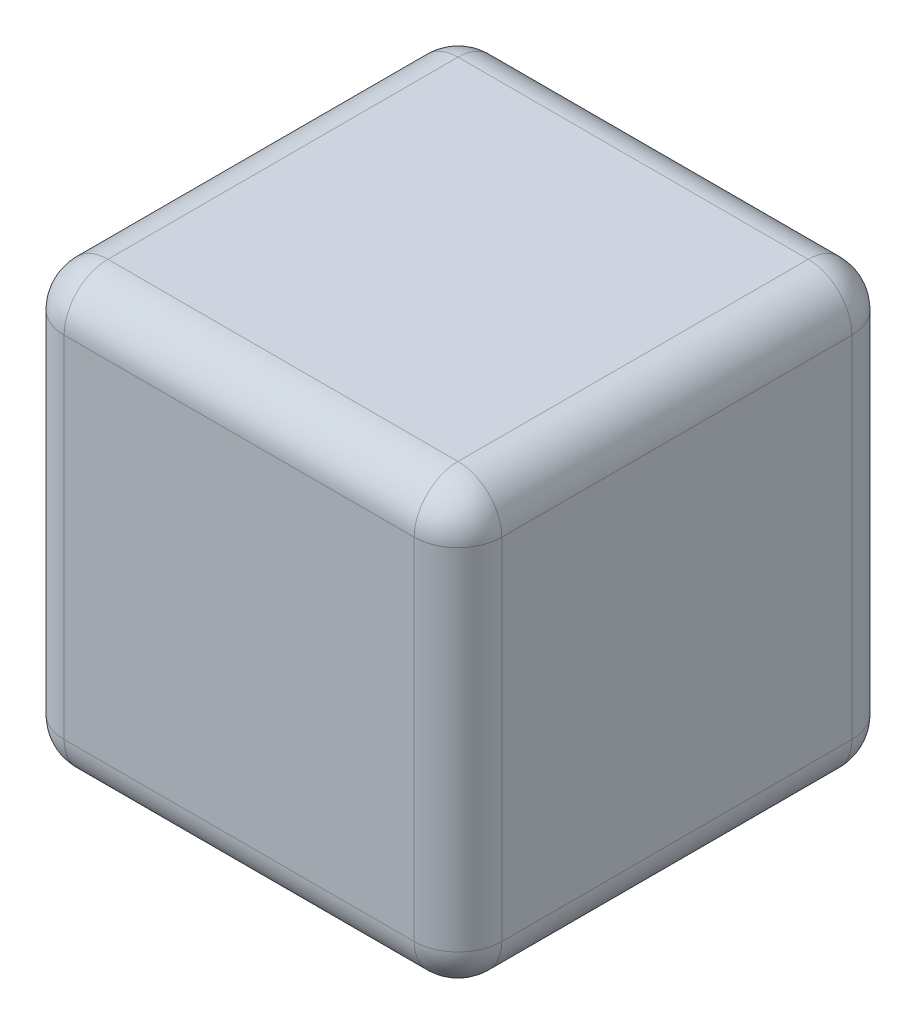
ISO-10303-21;
HEADER;
FILE_DESCRIPTION(('STEP AP214'),'2;1');
FILE_NAME('part.step','',(''),(''),'','','');
FILE_SCHEMA(('AUTOMOTIVE_DESIGN { 1 0 10303 214 1 1 1 1 }'));
ENDSEC;
DATA;
#1=APPLICATION_CONTEXT('core data for automotive mechanical design processes');
#2=APPLICATION_PROTOCOL_DEFINITION('international standard','automotive_design',2000,#1);
#3=PRODUCT_CONTEXT('',#1,'mechanical');
#4=PRODUCT('Part','Part','',(#3));
#5=PRODUCT_RELATED_PRODUCT_CATEGORY('part','',(#4));
#6=PRODUCT_DEFINITION_FORMATION('','',#4);
#7=PRODUCT_DEFINITION_CONTEXT('part definition',#1,'design');
#8=PRODUCT_DEFINITION('design','',#6,#7);
#9=PRODUCT_DEFINITION_SHAPE('','',#8);
#10=(LENGTH_UNIT() NAMED_UNIT(*) SI_UNIT(.MILLI.,.METRE.));
#11=(NAMED_UNIT(*) PLANE_ANGLE_UNIT() SI_UNIT($,.RADIAN.));
#12=(NAMED_UNIT(*) SI_UNIT($,.STERADIAN.) SOLID_ANGLE_UNIT());
#13=UNCERTAINTY_MEASURE_WITH_UNIT(LENGTH_MEASURE(1.E-05),#10,'distance_accuracy_value','');
#14=(GEOMETRIC_REPRESENTATION_CONTEXT(3) GLOBAL_UNCERTAINTY_ASSIGNED_CONTEXT((#13)) GLOBAL_UNIT_ASSIGNED_CONTEXT((#10,
#11,#12)) REPRESENTATION_CONTEXT('',''));
#15=CARTESIAN_POINT('',(0.,0.,0.));
#16=DIRECTION('',(0.,0.,1.));
#17=DIRECTION('',(1.,0.,0.));
#18=AXIS2_PLACEMENT_3D('',#15,#16,#17);
#19=CARTESIAN_POINT('',(2.5,5.,-2.5));
#20=DIRECTION('',(-1.,0.,0.));
#21=DIRECTION('',(0.,0.,1.));
#22=AXIS2_PLACEMENT_3D('',#19,#20,#21);
#23=PLANE('',#22);
#24=DIRECTION('',(0.,0.,-1.));
#25=VECTOR('',#24,1.);
#26=CARTESIAN_POINT('',(2.5,0.5,-2.5));
#27=LINE('',#26,#25);
#28=CARTESIAN_POINT('',(2.5,0.5,2.));
#29=VERTEX_POINT('',#28);
#30=CARTESIAN_POINT('',(2.5,0.5,-2.));
#31=VERTEX_POINT('',#30);
#32=EDGE_CURVE('E167',#29,#31,#27,.T.);
#33=ORIENTED_EDGE('',*,*,#32,.T.);
#34=DIRECTION('',(0.,-1.,0.));
#35=VECTOR('',#34,1.);
#36=CARTESIAN_POINT('',(2.5,5.,-2.));
#37=LINE('',#36,#35);
#38=CARTESIAN_POINT('',(2.5,4.5,-2.));
#39=VERTEX_POINT('',#38);
#40=EDGE_CURVE('E169',#31,#39,#37,.F.);
#41=ORIENTED_EDGE('',*,*,#40,.T.);
#42=DIRECTION('',(0.,0.,-1.));
#43=VECTOR('',#42,1.);
#44=CARTESIAN_POINT('',(2.5,4.5,2.5));
#45=LINE('',#44,#43);
#46=CARTESIAN_POINT('',(2.5,4.5,2.));
#47=VERTEX_POINT('',#46);
#48=EDGE_CURVE('E163',#39,#47,#45,.F.);
#49=ORIENTED_EDGE('',*,*,#48,.T.);
#50=DIRECTION('',(0.,-1.,0.));
#51=VECTOR('',#50,1.);
#52=CARTESIAN_POINT('',(2.5,5.,2.));
#53=LINE('',#52,#51);
#54=EDGE_CURVE('E165',#47,#29,#53,.T.);
#55=ORIENTED_EDGE('',*,*,#54,.T.);
#56=EDGE_LOOP('',(#33,#41,#49,#55));
#57=FACE_BOUND('',#56,.T.);
#58=ADVANCED_FACE('F32',(#57),#23,.F.);
#59=CARTESIAN_POINT('',(-2.5,5.,-2.5));
#60=DIRECTION('',(0.,0.,1.));
#61=DIRECTION('',(1.,0.,0.));
#62=AXIS2_PLACEMENT_3D('',#59,#60,#61);
#63=PLANE('',#62);
#64=DIRECTION('',(0.,-1.,0.));
#65=VECTOR('',#64,1.);
#66=CARTESIAN_POINT('',(2.,5.,-2.5));
#67=LINE('',#66,#65);
#68=CARTESIAN_POINT('',(2.,4.5,-2.5));
#69=VERTEX_POINT('',#68);
#70=CARTESIAN_POINT('',(2.,0.5,-2.5));
#71=VERTEX_POINT('',#70);
#72=EDGE_CURVE('E131',#69,#71,#67,.T.);
#73=ORIENTED_EDGE('',*,*,#72,.T.);
#74=DIRECTION('',(-1.,0.,0.));
#75=VECTOR('',#74,1.);
#76=CARTESIAN_POINT('',(-2.5,0.5,-2.5));
#77=LINE('',#76,#75);
#78=CARTESIAN_POINT('',(-2.,0.5,-2.5));
#79=VERTEX_POINT('',#78);
#80=EDGE_CURVE('E127',#71,#79,#77,.T.);
#81=ORIENTED_EDGE('',*,*,#80,.T.);
#82=DIRECTION('',(0.,-1.,0.));
#83=VECTOR('',#82,1.);
#84=CARTESIAN_POINT('',(-2.,5.,-2.5));
#85=LINE('',#84,#83);
#86=CARTESIAN_POINT('',(-2.,4.5,-2.5));
#87=VERTEX_POINT('',#86);
#88=EDGE_CURVE('E119',#79,#87,#85,.F.);
#89=ORIENTED_EDGE('',*,*,#88,.T.);
#90=DIRECTION('',(-1.,0.,0.));
#91=VECTOR('',#90,1.);
#92=CARTESIAN_POINT('',(2.5,4.5,-2.5));
#93=LINE('',#92,#91);
#94=EDGE_CURVE('E124',#87,#69,#93,.F.);
#95=ORIENTED_EDGE('',*,*,#94,.T.);
#96=EDGE_LOOP('',(#73,#81,#89,#95));
#97=FACE_BOUND('',#96,.T.);
#98=ADVANCED_FACE('F122',(#97),#63,.F.);
#99=CARTESIAN_POINT('',(-2.5,5.,-2.5));
#100=DIRECTION('',(1.,0.,0.));
#101=DIRECTION('',(0.,0.,-1.));
#102=AXIS2_PLACEMENT_3D('',#99,#100,#101);
#103=PLANE('',#102);
#104=DIRECTION('',(0.,0.,1.));
#105=VECTOR('',#104,1.);
#106=CARTESIAN_POINT('',(-2.5,4.5,-2.5));
#107=LINE('',#106,#105);
#108=CARTESIAN_POINT('',(-2.5,4.5,2.));
#109=VERTEX_POINT('',#108);
#110=CARTESIAN_POINT('',(-2.5,4.5,-2.));
#111=VERTEX_POINT('',#110);
#112=EDGE_CURVE('E172',#109,#111,#107,.F.);
#113=ORIENTED_EDGE('',*,*,#112,.T.);
#114=DIRECTION('',(0.,-1.,0.));
#115=VECTOR('',#114,1.);
#116=CARTESIAN_POINT('',(-2.5,5.,-2.));
#117=LINE('',#116,#115);
#118=CARTESIAN_POINT('',(-2.5,0.5,-2.));
#119=VERTEX_POINT('',#118);
#120=EDGE_CURVE('E139',#111,#119,#117,.T.);
#121=ORIENTED_EDGE('',*,*,#120,.T.);
#122=DIRECTION('',(0.,0.,1.));
#123=VECTOR('',#122,1.);
#124=CARTESIAN_POINT('',(-2.5,0.5,-2.5));
#125=LINE('',#124,#123);
#126=CARTESIAN_POINT('',(-2.5,0.5,2.));
#127=VERTEX_POINT('',#126);
#128=EDGE_CURVE('E176',#119,#127,#125,.T.);
#129=ORIENTED_EDGE('',*,*,#128,.T.);
#130=DIRECTION('',(0.,-1.,0.));
#131=VECTOR('',#130,1.);
#132=CARTESIAN_POINT('',(-2.5,5.,2.));
#133=LINE('',#132,#131);
#134=EDGE_CURVE('E174',#127,#109,#133,.F.);
#135=ORIENTED_EDGE('',*,*,#134,.T.);
#136=EDGE_LOOP('',(#113,#121,#129,#135));
#137=FACE_BOUND('',#136,.T.);
#138=ADVANCED_FACE('F296',(#137),#103,.F.);
#139=CARTESIAN_POINT('',(-2.5,5.,2.5));
#140=DIRECTION('',(0.,0.,-1.));
#141=DIRECTION('',(-1.,0.,0.));
#142=AXIS2_PLACEMENT_3D('',#139,#140,#141);
#143=PLANE('',#142);
#144=DIRECTION('',(1.,0.,0.));
#145=VECTOR('',#144,1.);
#146=CARTESIAN_POINT('',(-2.5,4.5,2.5));
#147=LINE('',#146,#145);
#148=CARTESIAN_POINT('',(2.,4.5,2.5));
#149=VERTEX_POINT('',#148);
#150=CARTESIAN_POINT('',(-2.,4.5,2.5));
#151=VERTEX_POINT('',#150);
#152=EDGE_CURVE('E188',#149,#151,#147,.F.);
#153=ORIENTED_EDGE('',*,*,#152,.T.);
#154=DIRECTION('',(0.,-1.,0.));
#155=VECTOR('',#154,1.);
#156=CARTESIAN_POINT('',(-2.,5.,2.5));
#157=LINE('',#156,#155);
#158=CARTESIAN_POINT('',(-2.,0.5,2.5));
#159=VERTEX_POINT('',#158);
#160=EDGE_CURVE('E194',#151,#159,#157,.T.);
#161=ORIENTED_EDGE('',*,*,#160,.T.);
#162=DIRECTION('',(1.,0.,0.));
#163=VECTOR('',#162,1.);
#164=CARTESIAN_POINT('',(-2.5,0.5,2.5));
#165=LINE('',#164,#163);
#166=CARTESIAN_POINT('',(2.,0.5,2.5));
#167=VERTEX_POINT('',#166);
#168=EDGE_CURVE('E192',#159,#167,#165,.T.);
#169=ORIENTED_EDGE('',*,*,#168,.T.);
#170=DIRECTION('',(0.,-1.,0.));
#171=VECTOR('',#170,1.);
#172=CARTESIAN_POINT('',(2.,5.,2.5));
#173=LINE('',#172,#171);
#174=EDGE_CURVE('E190',#167,#149,#173,.F.);
#175=ORIENTED_EDGE('',*,*,#174,.T.);
#176=EDGE_LOOP('',(#153,#161,#169,#175));
#177=FACE_BOUND('',#176,.T.);
#178=ADVANCED_FACE('F273',(#177),#143,.F.);
#179=CARTESIAN_POINT('',(0.,5.,0.));
#180=DIRECTION('',(0.,1.,0.));
#181=DIRECTION('',(0.,0.,1.));
#182=AXIS2_PLACEMENT_3D('',#179,#180,#181);
#183=PLANE('',#182);
#184=DIRECTION('',(-1.,0.,0.));
#185=VECTOR('',#184,1.);
#186=CARTESIAN_POINT('',(-2.5,5.,-2.));
#187=LINE('',#186,#185);
#188=CARTESIAN_POINT('',(2.,5.,-2.));
#189=VERTEX_POINT('',#188);
#190=CARTESIAN_POINT('',(-2.,5.,-2.));
#191=VERTEX_POINT('',#190);
#192=EDGE_CURVE('E41',#189,#191,#187,.T.);
#193=ORIENTED_EDGE('',*,*,#192,.T.);
#194=DIRECTION('',(0.,0.,1.));
#195=VECTOR('',#194,1.);
#196=CARTESIAN_POINT('',(-2.,5.,2.5));
#197=LINE('',#196,#195);
#198=CARTESIAN_POINT('',(-2.,5.,2.));
#199=VERTEX_POINT('',#198);
#200=EDGE_CURVE('E11',#191,#199,#197,.T.);
#201=ORIENTED_EDGE('',*,*,#200,.T.);
#202=DIRECTION('',(1.,0.,0.));
#203=VECTOR('',#202,1.);
#204=CARTESIAN_POINT('',(2.5,5.,2.));
#205=LINE('',#204,#203);
#206=CARTESIAN_POINT('',(2.,5.,2.));
#207=VERTEX_POINT('',#206);
#208=EDGE_CURVE('E197',#199,#207,#205,.T.);
#209=ORIENTED_EDGE('',*,*,#208,.T.);
#210=DIRECTION('',(0.,0.,-1.));
#211=VECTOR('',#210,1.);
#212=CARTESIAN_POINT('',(2.,5.,-2.5));
#213=LINE('',#212,#211);
#214=EDGE_CURVE('E52',#207,#189,#213,.T.);
#215=ORIENTED_EDGE('',*,*,#214,.T.);
#216=EDGE_LOOP('',(#193,#201,#209,#215));
#217=FACE_BOUND('',#216,.T.);
#218=ADVANCED_FACE('F303',(#217),#183,.T.);
#219=CARTESIAN_POINT('',(0.,0.,0.));
#220=DIRECTION('',(0.,1.,0.));
#221=DIRECTION('',(0.,0.,1.));
#222=AXIS2_PLACEMENT_3D('',#219,#220,#221);
#223=PLANE('',#222);
#224=DIRECTION('',(0.,0.,1.));
#225=VECTOR('',#224,1.);
#226=CARTESIAN_POINT('',(-2.,0.,0.));
#227=LINE('',#226,#225);
#228=CARTESIAN_POINT('',(-2.,0.,2.));
#229=VERTEX_POINT('',#228);
#230=CARTESIAN_POINT('',(-2.,0.,-2.));
#231=VERTEX_POINT('',#230);
#232=EDGE_CURVE('E183',#229,#231,#227,.F.);
#233=ORIENTED_EDGE('',*,*,#232,.T.);
#234=DIRECTION('',(-1.,0.,0.));
#235=VECTOR('',#234,1.);
#236=CARTESIAN_POINT('',(0.,0.,-2.));
#237=LINE('',#236,#235);
#238=CARTESIAN_POINT('',(2.,0.,-2.));
#239=VERTEX_POINT('',#238);
#240=EDGE_CURVE('E185',#231,#239,#237,.F.);
#241=ORIENTED_EDGE('',*,*,#240,.T.);
#242=DIRECTION('',(0.,0.,-1.));
#243=VECTOR('',#242,1.);
#244=CARTESIAN_POINT('',(2.,0.,0.));
#245=LINE('',#244,#243);
#246=CARTESIAN_POINT('',(2.,0.,2.));
#247=VERTEX_POINT('',#246);
#248=EDGE_CURVE('E181',#239,#247,#245,.F.);
#249=ORIENTED_EDGE('',*,*,#248,.T.);
#250=DIRECTION('',(1.,0.,0.));
#251=VECTOR('',#250,1.);
#252=CARTESIAN_POINT('',(0.,0.,2.));
#253=LINE('',#252,#251);
#254=EDGE_CURVE('E179',#247,#229,#253,.F.);
#255=ORIENTED_EDGE('',*,*,#254,.T.);
#256=EDGE_LOOP('',(#233,#241,#249,#255));
#257=FACE_BOUND('',#256,.T.);
#258=ADVANCED_FACE('F264',(#257),#223,.F.);
#259=CARTESIAN_POINT('',(-2.,5.,2.));
#260=DIRECTION('',(0.,-1.,0.));
#261=DIRECTION('',(0.,0.,-1.));
#262=AXIS2_PLACEMENT_3D('',#259,#260,#261);
#263=CYLINDRICAL_SURFACE('',#262,0.5);
#264=CARTESIAN_POINT('',(-2.,4.5,2.));
#265=DIRECTION('',(0.,1.,0.));
#266=DIRECTION('',(0.,0.,1.));
#267=AXIS2_PLACEMENT_3D('',#264,#265,#266);
#268=CIRCLE('',#267,0.5);
#269=EDGE_CURVE('E36',#109,#151,#268,.T.);
#270=ORIENTED_EDGE('',*,*,#269,.F.);
#271=ORIENTED_EDGE('',*,*,#134,.F.);
#272=CARTESIAN_POINT('',(-2.,0.5,2.));
#273=DIRECTION('',(0.,-1.,0.));
#274=DIRECTION('',(0.,0.,-1.));
#275=AXIS2_PLACEMENT_3D('',#272,#273,#274);
#276=CIRCLE('',#275,0.5);
#277=EDGE_CURVE('E159',#159,#127,#276,.T.);
#278=ORIENTED_EDGE('',*,*,#277,.F.);
#279=ORIENTED_EDGE('',*,*,#160,.F.);
#280=EDGE_LOOP('',(#270,#271,#278,#279));
#281=FACE_BOUND('',#280,.T.);
#282=ADVANCED_FACE('F34',(#281),#263,.T.);
#283=CARTESIAN_POINT('',(-2.,4.5,2.));
#284=DIRECTION('',(0.,0.,1.));
#285=DIRECTION('',(1.,0.,0.));
#286=AXIS2_PLACEMENT_3D('',#283,#284,#285);
#287=SPHERICAL_SURFACE('',#286,0.5);
#288=CARTESIAN_POINT('',(-2.,4.5,2.));
#289=DIRECTION('',(0.,0.,1.));
#290=DIRECTION('',(1.,0.,0.));
#291=AXIS2_PLACEMENT_3D('',#288,#289,#290);
#292=CIRCLE('',#291,0.5);
#293=EDGE_CURVE('E243',#109,#199,#292,.F.);
#294=ORIENTED_EDGE('',*,*,#293,.F.);
#295=ORIENTED_EDGE('',*,*,#269,.T.);
#296=CARTESIAN_POINT('',(-2.,4.5,2.));
#297=DIRECTION('',(-1.,0.,0.));
#298=DIRECTION('',(0.,0.,1.));
#299=AXIS2_PLACEMENT_3D('',#296,#297,#298);
#300=CIRCLE('',#299,0.5);
#301=EDGE_CURVE('E246',#199,#151,#300,.F.);
#302=ORIENTED_EDGE('',*,*,#301,.F.);
#303=EDGE_LOOP('',(#294,#295,#302));
#304=FACE_BOUND('',#303,.T.);
#305=ADVANCED_FACE('F291',(#304),#287,.T.);
#306=CARTESIAN_POINT('',(-2.,0.5,2.));
#307=DIRECTION('',(0.,0.,1.));
#308=DIRECTION('',(1.,0.,0.));
#309=AXIS2_PLACEMENT_3D('',#306,#307,#308);
#310=SPHERICAL_SURFACE('',#309,0.5);
#311=CARTESIAN_POINT('',(-2.,0.5,2.));
#312=DIRECTION('',(-1.,0.,0.));
#313=DIRECTION('',(0.,0.,1.));
#314=AXIS2_PLACEMENT_3D('',#311,#312,#313);
#315=CIRCLE('',#314,0.5);
#316=EDGE_CURVE('E237',#159,#229,#315,.F.);
#317=ORIENTED_EDGE('',*,*,#316,.F.);
#318=ORIENTED_EDGE('',*,*,#277,.T.);
#319=CARTESIAN_POINT('',(-2.,0.5,2.));
#320=DIRECTION('',(0.,0.,1.));
#321=DIRECTION('',(1.,0.,0.));
#322=AXIS2_PLACEMENT_3D('',#319,#320,#321);
#323=CIRCLE('',#322,0.5);
#324=EDGE_CURVE('E240',#229,#127,#323,.F.);
#325=ORIENTED_EDGE('',*,*,#324,.F.);
#326=EDGE_LOOP('',(#317,#318,#325));
#327=FACE_BOUND('',#326,.T.);
#328=ADVANCED_FACE('F253',(#327),#310,.T.);
#329=CARTESIAN_POINT('',(0.,4.5,2.));
#330=DIRECTION('',(-1.,0.,0.));
#331=DIRECTION('',(0.,0.,1.));
#332=AXIS2_PLACEMENT_3D('',#329,#330,#331);
#333=CYLINDRICAL_SURFACE('',#332,0.5);
#334=ORIENTED_EDGE('',*,*,#301,.T.);
#335=ORIENTED_EDGE('',*,*,#152,.F.);
#336=CARTESIAN_POINT('',(2.,4.5,2.));
#337=DIRECTION('',(1.,0.,0.));
#338=DIRECTION('',(0.,0.,-1.));
#339=AXIS2_PLACEMENT_3D('',#336,#337,#338);
#340=CIRCLE('',#339,0.5);
#341=EDGE_CURVE('E231',#207,#149,#340,.T.);
#342=ORIENTED_EDGE('',*,*,#341,.F.);
#343=ORIENTED_EDGE('',*,*,#208,.F.);
#344=EDGE_LOOP('',(#334,#335,#342,#343));
#345=FACE_BOUND('',#344,.T.);
#346=ADVANCED_FACE('F286',(#345),#333,.T.);
#347=CARTESIAN_POINT('',(-2.,4.5,0.));
#348=DIRECTION('',(0.,0.,-1.));
#349=DIRECTION('',(-1.,0.,0.));
#350=AXIS2_PLACEMENT_3D('',#347,#348,#349);
#351=CYLINDRICAL_SURFACE('',#350,0.5);
#352=ORIENTED_EDGE('',*,*,#293,.T.);
#353=ORIENTED_EDGE('',*,*,#200,.F.);
#354=CARTESIAN_POINT('',(-2.,4.5,-2.));
#355=DIRECTION('',(0.,0.,-1.));
#356=DIRECTION('',(-1.,0.,0.));
#357=AXIS2_PLACEMENT_3D('',#354,#355,#356);
#358=CIRCLE('',#357,0.5);
#359=EDGE_CURVE('E143',#111,#191,#358,.T.);
#360=ORIENTED_EDGE('',*,*,#359,.F.);
#361=ORIENTED_EDGE('',*,*,#112,.F.);
#362=EDGE_LOOP('',(#352,#353,#360,#361));
#363=FACE_BOUND('',#362,.T.);
#364=ADVANCED_FACE('F294',(#363),#351,.T.);
#365=CARTESIAN_POINT('',(-2.,5.,-2.));
#366=DIRECTION('',(0.,-1.,0.));
#367=DIRECTION('',(0.,0.,-1.));
#368=AXIS2_PLACEMENT_3D('',#365,#366,#367);
#369=CYLINDRICAL_SURFACE('',#368,0.5);
#370=CARTESIAN_POINT('',(-2.,0.5,-2.));
#371=DIRECTION('',(0.,-1.,0.));
#372=DIRECTION('',(0.,0.,-1.));
#373=AXIS2_PLACEMENT_3D('',#370,#371,#372);
#374=CIRCLE('',#373,0.5);
#375=EDGE_CURVE('E144',#119,#79,#374,.T.);
#376=ORIENTED_EDGE('',*,*,#375,.F.);
#377=ORIENTED_EDGE('',*,*,#120,.F.);
#378=CARTESIAN_POINT('',(-2.,4.5,-2.));
#379=DIRECTION('',(0.,1.,0.));
#380=DIRECTION('',(0.,0.,1.));
#381=AXIS2_PLACEMENT_3D('',#378,#379,#380);
#382=CIRCLE('',#381,0.5);
#383=EDGE_CURVE('E135',#87,#111,#382,.T.);
#384=ORIENTED_EDGE('',*,*,#383,.F.);
#385=ORIENTED_EDGE('',*,*,#88,.F.);
#386=EDGE_LOOP('',(#376,#377,#384,#385));
#387=FACE_BOUND('',#386,.T.);
#388=ADVANCED_FACE('F137',(#387),#369,.T.);
#389=CARTESIAN_POINT('',(-2.,0.5,-2.5));
#390=DIRECTION('',(0.,0.,1.));
#391=DIRECTION('',(1.,0.,0.));
#392=AXIS2_PLACEMENT_3D('',#389,#390,#391);
#393=CYLINDRICAL_SURFACE('',#392,0.5);
#394=ORIENTED_EDGE('',*,*,#324,.T.);
#395=ORIENTED_EDGE('',*,*,#128,.F.);
#396=CARTESIAN_POINT('',(-2.,0.5,-2.));
#397=DIRECTION('',(0.,0.,-1.));
#398=DIRECTION('',(-1.,0.,0.));
#399=AXIS2_PLACEMENT_3D('',#396,#397,#398);
#400=CIRCLE('',#399,0.5);
#401=EDGE_CURVE('E227',#231,#119,#400,.T.);
#402=ORIENTED_EDGE('',*,*,#401,.F.);
#403=ORIENTED_EDGE('',*,*,#232,.F.);
#404=EDGE_LOOP('',(#394,#395,#402,#403));
#405=FACE_BOUND('',#404,.T.);
#406=ADVANCED_FACE('F260',(#405),#393,.T.);
#407=CARTESIAN_POINT('',(-2.5,0.5,2.));
#408=DIRECTION('',(1.,0.,0.));
#409=DIRECTION('',(0.,0.,-1.));
#410=AXIS2_PLACEMENT_3D('',#407,#408,#409);
#411=CYLINDRICAL_SURFACE('',#410,0.5);
#412=ORIENTED_EDGE('',*,*,#316,.T.);
#413=ORIENTED_EDGE('',*,*,#254,.F.);
#414=CARTESIAN_POINT('',(2.,0.5,2.));
#415=DIRECTION('',(1.,0.,0.));
#416=DIRECTION('',(0.,0.,-1.));
#417=AXIS2_PLACEMENT_3D('',#414,#415,#416);
#418=CIRCLE('',#417,0.5);
#419=EDGE_CURVE('E224',#167,#247,#418,.T.);
#420=ORIENTED_EDGE('',*,*,#419,.F.);
#421=ORIENTED_EDGE('',*,*,#168,.F.);
#422=EDGE_LOOP('',(#412,#413,#420,#421));
#423=FACE_BOUND('',#422,.T.);
#424=ADVANCED_FACE('F270',(#423),#411,.T.);
#425=CARTESIAN_POINT('',(2.,5.,2.));
#426=DIRECTION('',(0.,-1.,0.));
#427=DIRECTION('',(0.,0.,-1.));
#428=AXIS2_PLACEMENT_3D('',#425,#426,#427);
#429=CYLINDRICAL_SURFACE('',#428,0.5);
#430=CARTESIAN_POINT('',(2.,4.5,2.));
#431=DIRECTION('',(0.,1.,0.));
#432=DIRECTION('',(0.,0.,1.));
#433=AXIS2_PLACEMENT_3D('',#430,#431,#432);
#434=CIRCLE('',#433,0.5);
#435=EDGE_CURVE('E234',#149,#47,#434,.T.);
#436=ORIENTED_EDGE('',*,*,#435,.F.);
#437=ORIENTED_EDGE('',*,*,#174,.F.);
#438=CARTESIAN_POINT('',(2.,0.5,2.));
#439=DIRECTION('',(0.,-1.,0.));
#440=DIRECTION('',(0.,0.,-1.));
#441=AXIS2_PLACEMENT_3D('',#438,#439,#440);
#442=CIRCLE('',#441,0.5);
#443=EDGE_CURVE('E221',#29,#167,#442,.T.);
#444=ORIENTED_EDGE('',*,*,#443,.F.);
#445=ORIENTED_EDGE('',*,*,#54,.F.);
#446=EDGE_LOOP('',(#436,#437,#444,#445));
#447=FACE_BOUND('',#446,.T.);
#448=ADVANCED_FACE('F278',(#447),#429,.T.);
#449=CARTESIAN_POINT('',(2.,4.5,2.));
#450=DIRECTION('',(0.,0.,1.));
#451=DIRECTION('',(1.,0.,0.));
#452=AXIS2_PLACEMENT_3D('',#449,#450,#451);
#453=SPHERICAL_SURFACE('',#452,0.5);
#454=ORIENTED_EDGE('',*,*,#341,.T.);
#455=ORIENTED_EDGE('',*,*,#435,.T.);
#456=CARTESIAN_POINT('',(2.,4.5,2.));
#457=DIRECTION('',(0.,0.,1.));
#458=DIRECTION('',(0.,-1.,0.));
#459=AXIS2_PLACEMENT_3D('',#456,#457,#458);
#460=CIRCLE('',#459,0.5);
#461=EDGE_CURVE('E150',#207,#47,#460,.F.);
#462=ORIENTED_EDGE('',*,*,#461,.F.);
#463=EDGE_LOOP('',(#454,#455,#462));
#464=FACE_BOUND('',#463,.T.);
#465=ADVANCED_FACE('F284',(#464),#453,.T.);
#466=CARTESIAN_POINT('',(-2.,4.5,-2.));
#467=DIRECTION('',(0.,0.,1.));
#468=DIRECTION('',(1.,0.,0.));
#469=AXIS2_PLACEMENT_3D('',#466,#467,#468);
#470=SPHERICAL_SURFACE('',#469,0.5);
#471=ORIENTED_EDGE('',*,*,#383,.T.);
#472=ORIENTED_EDGE('',*,*,#359,.T.);
#473=CARTESIAN_POINT('',(-2.,4.5,-2.));
#474=DIRECTION('',(-1.,0.,0.));
#475=DIRECTION('',(0.,0.,1.));
#476=AXIS2_PLACEMENT_3D('',#473,#474,#475);
#477=CIRCLE('',#476,0.5);
#478=EDGE_CURVE('E147',#87,#191,#477,.F.);
#479=ORIENTED_EDGE('',*,*,#478,.F.);
#480=EDGE_LOOP('',(#471,#472,#479));
#481=FACE_BOUND('',#480,.T.);
#482=ADVANCED_FACE('F148',(#481),#470,.T.);
#483=CARTESIAN_POINT('',(-2.,0.5,-2.));
#484=DIRECTION('',(0.,0.,1.));
#485=DIRECTION('',(1.,0.,0.));
#486=AXIS2_PLACEMENT_3D('',#483,#484,#485);
#487=SPHERICAL_SURFACE('',#486,0.5);
#488=ORIENTED_EDGE('',*,*,#401,.T.);
#489=ORIENTED_EDGE('',*,*,#375,.T.);
#490=CARTESIAN_POINT('',(-2.,0.5,-2.));
#491=DIRECTION('',(-1.,0.,0.));
#492=DIRECTION('',(0.,0.,1.));
#493=AXIS2_PLACEMENT_3D('',#490,#491,#492);
#494=CIRCLE('',#493,0.5);
#495=EDGE_CURVE('E151',#231,#79,#494,.F.);
#496=ORIENTED_EDGE('',*,*,#495,.F.);
#497=EDGE_LOOP('',(#488,#489,#496));
#498=FACE_BOUND('',#497,.T.);
#499=ADVANCED_FACE('F341',(#498),#487,.T.);
#500=CARTESIAN_POINT('',(2.,0.5,2.));
#501=DIRECTION('',(0.,0.,1.));
#502=DIRECTION('',(1.,0.,0.));
#503=AXIS2_PLACEMENT_3D('',#500,#501,#502);
#504=SPHERICAL_SURFACE('',#503,0.5);
#505=ORIENTED_EDGE('',*,*,#443,.T.);
#506=ORIENTED_EDGE('',*,*,#419,.T.);
#507=CARTESIAN_POINT('',(2.,0.5,2.));
#508=DIRECTION('',(0.,0.,1.));
#509=DIRECTION('',(1.,0.,0.));
#510=AXIS2_PLACEMENT_3D('',#507,#508,#509);
#511=CIRCLE('',#510,0.5);
#512=EDGE_CURVE('E214',#29,#247,#511,.F.);
#513=ORIENTED_EDGE('',*,*,#512,.F.);
#514=EDGE_LOOP('',(#505,#506,#513));
#515=FACE_BOUND('',#514,.T.);
#516=ADVANCED_FACE('F337',(#515),#504,.T.);
#517=CARTESIAN_POINT('',(2.,4.5,0.));
#518=DIRECTION('',(0.,0.,1.));
#519=DIRECTION('',(1.,0.,0.));
#520=AXIS2_PLACEMENT_3D('',#517,#518,#519);
#521=CYLINDRICAL_SURFACE('',#520,0.5);
#522=ORIENTED_EDGE('',*,*,#461,.T.);
#523=ORIENTED_EDGE('',*,*,#48,.F.);
#524=CARTESIAN_POINT('',(2.,4.5,-2.));
#525=DIRECTION('',(0.,0.,-1.));
#526=DIRECTION('',(-1.,0.,0.));
#527=AXIS2_PLACEMENT_3D('',#524,#525,#526);
#528=CIRCLE('',#527,0.5);
#529=EDGE_CURVE('E211',#189,#39,#528,.T.);
#530=ORIENTED_EDGE('',*,*,#529,.F.);
#531=ORIENTED_EDGE('',*,*,#214,.F.);
#532=EDGE_LOOP('',(#522,#523,#530,#531));
#533=FACE_BOUND('',#532,.T.);
#534=ADVANCED_FACE('F334',(#533),#521,.T.);
#535=CARTESIAN_POINT('',(0.,4.5,-2.));
#536=DIRECTION('',(1.,0.,0.));
#537=DIRECTION('',(0.,0.,-1.));
#538=AXIS2_PLACEMENT_3D('',#535,#536,#537);
#539=CYLINDRICAL_SURFACE('',#538,0.5);
#540=ORIENTED_EDGE('',*,*,#478,.T.);
#541=ORIENTED_EDGE('',*,*,#192,.F.);
#542=CARTESIAN_POINT('',(2.,4.5,-2.));
#543=DIRECTION('',(1.,0.,0.));
#544=DIRECTION('',(0.,1.,0.));
#545=AXIS2_PLACEMENT_3D('',#542,#543,#544);
#546=CIRCLE('',#545,0.5);
#547=EDGE_CURVE('E155',#69,#189,#546,.T.);
#548=ORIENTED_EDGE('',*,*,#547,.F.);
#549=ORIENTED_EDGE('',*,*,#94,.F.);
#550=EDGE_LOOP('',(#540,#541,#548,#549));
#551=FACE_BOUND('',#550,.T.);
#552=ADVANCED_FACE('F153',(#551),#539,.T.);
#553=CARTESIAN_POINT('',(-2.5,0.5,-2.));
#554=DIRECTION('',(-1.,0.,0.));
#555=DIRECTION('',(0.,0.,1.));
#556=AXIS2_PLACEMENT_3D('',#553,#554,#555);
#557=CYLINDRICAL_SURFACE('',#556,0.5);
#558=ORIENTED_EDGE('',*,*,#495,.T.);
#559=ORIENTED_EDGE('',*,*,#80,.F.);
#560=CARTESIAN_POINT('',(2.,0.5,-2.));
#561=DIRECTION('',(1.,0.,0.));
#562=DIRECTION('',(0.,0.,-1.));
#563=AXIS2_PLACEMENT_3D('',#560,#561,#562);
#564=CIRCLE('',#563,0.5);
#565=EDGE_CURVE('E207',#239,#71,#564,.T.);
#566=ORIENTED_EDGE('',*,*,#565,.F.);
#567=ORIENTED_EDGE('',*,*,#240,.F.);
#568=EDGE_LOOP('',(#558,#559,#566,#567));
#569=FACE_BOUND('',#568,.T.);
#570=ADVANCED_FACE('F327',(#569),#557,.T.);
#571=CARTESIAN_POINT('',(2.,0.5,-2.5));
#572=DIRECTION('',(0.,0.,-1.));
#573=DIRECTION('',(-1.,0.,0.));
#574=AXIS2_PLACEMENT_3D('',#571,#572,#573);
#575=CYLINDRICAL_SURFACE('',#574,0.5);
#576=ORIENTED_EDGE('',*,*,#512,.T.);
#577=ORIENTED_EDGE('',*,*,#248,.F.);
#578=CARTESIAN_POINT('',(2.,0.5,-2.));
#579=DIRECTION('',(0.,0.,-1.));
#580=DIRECTION('',(-1.,0.,0.));
#581=AXIS2_PLACEMENT_3D('',#578,#579,#580);
#582=CIRCLE('',#581,0.5);
#583=EDGE_CURVE('E205',#31,#239,#582,.T.);
#584=ORIENTED_EDGE('',*,*,#583,.F.);
#585=ORIENTED_EDGE('',*,*,#32,.F.);
#586=EDGE_LOOP('',(#576,#577,#584,#585));
#587=FACE_BOUND('',#586,.T.);
#588=ADVANCED_FACE('F323',(#587),#575,.T.);
#589=CARTESIAN_POINT('',(2.,4.5,-2.));
#590=DIRECTION('',(0.,0.,1.));
#591=DIRECTION('',(1.,0.,0.));
#592=AXIS2_PLACEMENT_3D('',#589,#590,#591);
#593=SPHERICAL_SURFACE('',#592,0.5);
#594=ORIENTED_EDGE('',*,*,#547,.T.);
#595=ORIENTED_EDGE('',*,*,#529,.T.);
#596=CARTESIAN_POINT('',(2.,4.5,-2.));
#597=DIRECTION('',(0.,1.,0.));
#598=DIRECTION('',(0.,0.,1.));
#599=AXIS2_PLACEMENT_3D('',#596,#597,#598);
#600=CIRCLE('',#599,0.5);
#601=EDGE_CURVE('E203',#69,#39,#600,.F.);
#602=ORIENTED_EDGE('',*,*,#601,.F.);
#603=EDGE_LOOP('',(#594,#595,#602));
#604=FACE_BOUND('',#603,.T.);
#605=ADVANCED_FACE('F319',(#604),#593,.T.);
#606=CARTESIAN_POINT('',(2.,0.5,-2.));
#607=DIRECTION('',(0.,0.,1.));
#608=DIRECTION('',(1.,0.,0.));
#609=AXIS2_PLACEMENT_3D('',#606,#607,#608);
#610=SPHERICAL_SURFACE('',#609,0.5);
#611=ORIENTED_EDGE('',*,*,#583,.T.);
#612=ORIENTED_EDGE('',*,*,#565,.T.);
#613=CARTESIAN_POINT('',(2.,0.5,-2.));
#614=DIRECTION('',(0.,-1.,0.));
#615=DIRECTION('',(0.,0.,-1.));
#616=AXIS2_PLACEMENT_3D('',#613,#614,#615);
#617=CIRCLE('',#616,0.5);
#618=EDGE_CURVE('E201',#31,#71,#617,.F.);
#619=ORIENTED_EDGE('',*,*,#618,.F.);
#620=EDGE_LOOP('',(#611,#612,#619));
#621=FACE_BOUND('',#620,.T.);
#622=ADVANCED_FACE('F315',(#621),#610,.T.);
#623=CARTESIAN_POINT('',(2.,5.,-2.));
#624=DIRECTION('',(0.,-1.,0.));
#625=DIRECTION('',(0.,0.,-1.));
#626=AXIS2_PLACEMENT_3D('',#623,#624,#625);
#627=CYLINDRICAL_SURFACE('',#626,0.5);
#628=ORIENTED_EDGE('',*,*,#601,.T.);
#629=ORIENTED_EDGE('',*,*,#40,.F.);
#630=ORIENTED_EDGE('',*,*,#618,.T.);
#631=ORIENTED_EDGE('',*,*,#72,.F.);
#632=EDGE_LOOP('',(#628,#629,#630,#631));
#633=FACE_BOUND('',#632,.T.);
#634=ADVANCED_FACE('F312',(#633),#627,.T.);
#635=CLOSED_SHELL('',(#58,#98,#138,#178,#218,#258,#282,#305,#328,#346,#364,#388,#406,#424,#448,
#465,#482,#499,#516,#534,#552,#570,#588,#605,#622,#634));
#636=MANIFOLD_SOLID_BREP('B2',#635);
#637=ADVANCED_BREP_SHAPE_REPRESENTATION('',(#18,#636),#14);
#638=SHAPE_DEFINITION_REPRESENTATION(#9,#637);
ENDSEC;
END-ISO-10303-21;
